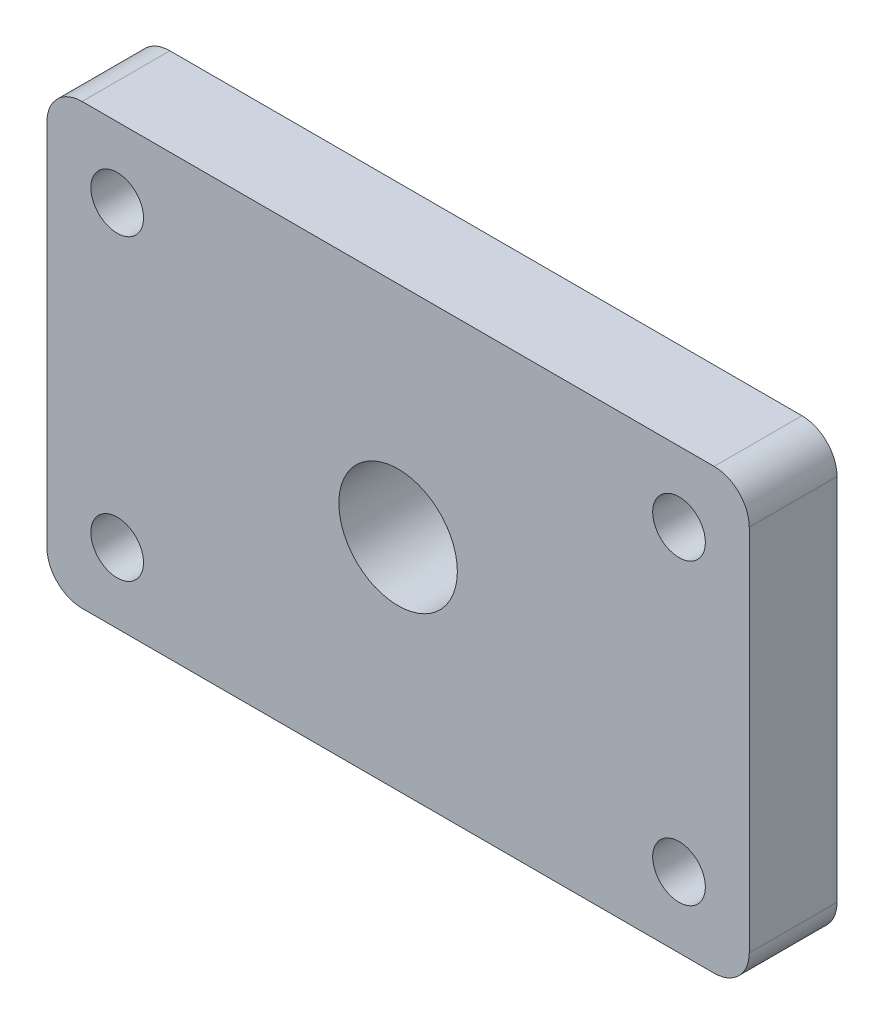
ISO-10303-21;
HEADER;
FILE_DESCRIPTION(('STEP AP214'),'2;1');
FILE_NAME('part.step','',(''),(''),'','','');
FILE_SCHEMA(('AUTOMOTIVE_DESIGN { 1 0 10303 214 1 1 1 1 }'));
ENDSEC;
DATA;
#1=APPLICATION_CONTEXT('core data for automotive mechanical design processes');
#2=APPLICATION_PROTOCOL_DEFINITION('international standard','automotive_design',2000,#1);
#3=PRODUCT_CONTEXT('',#1,'mechanical');
#4=PRODUCT('Part','Part','',(#3));
#5=PRODUCT_RELATED_PRODUCT_CATEGORY('part','',(#4));
#6=PRODUCT_DEFINITION_FORMATION('','',#4);
#7=PRODUCT_DEFINITION_CONTEXT('part definition',#1,'design');
#8=PRODUCT_DEFINITION('design','',#6,#7);
#9=PRODUCT_DEFINITION_SHAPE('','',#8);
#10=(LENGTH_UNIT() NAMED_UNIT(*) SI_UNIT(.MILLI.,.METRE.));
#11=(NAMED_UNIT(*) PLANE_ANGLE_UNIT() SI_UNIT($,.RADIAN.));
#12=(NAMED_UNIT(*) SI_UNIT($,.STERADIAN.) SOLID_ANGLE_UNIT());
#13=UNCERTAINTY_MEASURE_WITH_UNIT(LENGTH_MEASURE(1.E-05),#10,'distance_accuracy_value','');
#14=(GEOMETRIC_REPRESENTATION_CONTEXT(3) GLOBAL_UNCERTAINTY_ASSIGNED_CONTEXT((#13)) GLOBAL_UNIT_ASSIGNED_CONTEXT((#10,
#11,#12)) REPRESENTATION_CONTEXT('',''));
#15=CARTESIAN_POINT('',(0.,0.,0.));
#16=DIRECTION('',(0.,0.,1.));
#17=DIRECTION('',(1.,0.,0.));
#18=AXIS2_PLACEMENT_3D('',#15,#16,#17);
#19=CARTESIAN_POINT('',(-36.,-21.,10.));
#20=DIRECTION('',(0.,0.,1.));
#21=DIRECTION('',(1.,0.,0.));
#22=AXIS2_PLACEMENT_3D('',#19,#20,#21);
#23=PLANE('',#22);
#24=CARTESIAN_POINT('',(-32.,-17.,10.));
#25=DIRECTION('',(0.,0.,1.));
#26=DIRECTION('',(1.,0.,0.));
#27=AXIS2_PLACEMENT_3D('',#24,#25,#26);
#28=CIRCLE('',#27,3.);
#29=CARTESIAN_POINT('',(-29.,-17.,10.));
#30=VERTEX_POINT('',#29);
#31=EDGE_CURVE('E196',#30,#30,#28,.T.);
#32=ORIENTED_EDGE('',*,*,#31,.F.);
#33=EDGE_LOOP('',(#32));
#34=FACE_BOUND('',#33,.T.);
#35=CARTESIAN_POINT('',(32.,-17.,10.));
#36=DIRECTION('',(0.,0.,1.));
#37=DIRECTION('',(1.,0.,0.));
#38=AXIS2_PLACEMENT_3D('',#35,#36,#37);
#39=CIRCLE('',#38,3.00000000000001);
#40=CARTESIAN_POINT('',(35.,-17.,10.));
#41=VERTEX_POINT('',#40);
#42=EDGE_CURVE('E184',#41,#41,#39,.T.);
#43=ORIENTED_EDGE('',*,*,#42,.F.);
#44=EDGE_LOOP('',(#43));
#45=FACE_BOUND('',#44,.T.);
#46=CARTESIAN_POINT('',(-36.,-21.,10.));
#47=DIRECTION('',(0.,0.,1.));
#48=DIRECTION('',(1.,0.,0.));
#49=AXIS2_PLACEMENT_3D('',#46,#47,#48);
#50=CIRCLE('',#49,4.);
#51=CARTESIAN_POINT('',(-40.,-21.,10.));
#52=VERTEX_POINT('',#51);
#53=CARTESIAN_POINT('',(-36.,-25.,10.));
#54=VERTEX_POINT('',#53);
#55=EDGE_CURVE('E147',#52,#54,#50,.T.);
#56=ORIENTED_EDGE('',*,*,#55,.T.);
#57=DIRECTION('',(1.,0.,0.));
#58=VECTOR('',#57,1.);
#59=CARTESIAN_POINT('',(-36.,-25.,10.));
#60=LINE('',#59,#58);
#61=CARTESIAN_POINT('',(36.,-25.,10.));
#62=VERTEX_POINT('',#61);
#63=EDGE_CURVE('E95',#54,#62,#60,.T.);
#64=ORIENTED_EDGE('',*,*,#63,.T.);
#65=CARTESIAN_POINT('',(36.,-21.,10.));
#66=DIRECTION('',(0.,0.,1.));
#67=DIRECTION('',(1.,0.,0.));
#68=AXIS2_PLACEMENT_3D('',#65,#66,#67);
#69=CIRCLE('',#68,4.00000000000001);
#70=CARTESIAN_POINT('',(40.,-21.,10.));
#71=VERTEX_POINT('',#70);
#72=EDGE_CURVE('E162',#62,#71,#69,.T.);
#73=ORIENTED_EDGE('',*,*,#72,.T.);
#74=DIRECTION('',(0.,1.,0.));
#75=VECTOR('',#74,1.);
#76=CARTESIAN_POINT('',(40.,-21.,10.));
#77=LINE('',#76,#75);
#78=CARTESIAN_POINT('',(40.,21.,10.));
#79=VERTEX_POINT('',#78);
#80=EDGE_CURVE('E175',#71,#79,#77,.T.);
#81=ORIENTED_EDGE('',*,*,#80,.T.);
#82=CARTESIAN_POINT('',(36.,21.,10.));
#83=DIRECTION('',(0.,0.,1.));
#84=DIRECTION('',(1.,0.,0.));
#85=AXIS2_PLACEMENT_3D('',#82,#83,#84);
#86=CIRCLE('',#85,4.);
#87=CARTESIAN_POINT('',(36.,25.,10.));
#88=VERTEX_POINT('',#87);
#89=EDGE_CURVE('E114',#79,#88,#86,.T.);
#90=ORIENTED_EDGE('',*,*,#89,.T.);
#91=DIRECTION('',(-1.,0.,0.));
#92=VECTOR('',#91,1.);
#93=CARTESIAN_POINT('',(36.,25.,10.));
#94=LINE('',#93,#92);
#95=CARTESIAN_POINT('',(-36.,25.,10.));
#96=VERTEX_POINT('',#95);
#97=EDGE_CURVE('E108',#88,#96,#94,.T.);
#98=ORIENTED_EDGE('',*,*,#97,.T.);
#99=CARTESIAN_POINT('',(-36.,21.,10.));
#100=DIRECTION('',(0.,0.,1.));
#101=DIRECTION('',(1.,0.,0.));
#102=AXIS2_PLACEMENT_3D('',#99,#100,#101);
#103=CIRCLE('',#102,4.00000000000001);
#104=CARTESIAN_POINT('',(-40.,21.,10.));
#105=VERTEX_POINT('',#104);
#106=EDGE_CURVE('E112',#96,#105,#103,.T.);
#107=ORIENTED_EDGE('',*,*,#106,.T.);
#108=DIRECTION('',(0.,-1.,0.));
#109=VECTOR('',#108,1.);
#110=CARTESIAN_POINT('',(-40.,21.,10.));
#111=LINE('',#110,#109);
#112=EDGE_CURVE('E52',#105,#52,#111,.T.);
#113=ORIENTED_EDGE('',*,*,#112,.T.);
#114=EDGE_LOOP('',(#56,#64,#73,#81,#90,#98,#107,#113));
#115=FACE_BOUND('',#114,.T.);
#116=CARTESIAN_POINT('',(-32.,17.,10.));
#117=DIRECTION('',(0.,0.,1.));
#118=DIRECTION('',(1.,0.,0.));
#119=AXIS2_PLACEMENT_3D('',#116,#117,#118);
#120=CIRCLE('',#119,2.99999999999999);
#121=CARTESIAN_POINT('',(-29.,17.,10.));
#122=VERTEX_POINT('',#121);
#123=EDGE_CURVE('E136',#122,#122,#120,.T.);
#124=ORIENTED_EDGE('',*,*,#123,.F.);
#125=EDGE_LOOP('',(#124));
#126=FACE_BOUND('',#125,.T.);
#127=CARTESIAN_POINT('',(32.,17.,10.));
#128=DIRECTION('',(0.,0.,1.));
#129=DIRECTION('',(1.,0.,0.));
#130=AXIS2_PLACEMENT_3D('',#127,#128,#129);
#131=CIRCLE('',#130,3.00000000000001);
#132=CARTESIAN_POINT('',(35.,17.,10.));
#133=VERTEX_POINT('',#132);
#134=EDGE_CURVE('E190',#133,#133,#131,.T.);
#135=ORIENTED_EDGE('',*,*,#134,.F.);
#136=EDGE_LOOP('',(#135));
#137=FACE_BOUND('',#136,.T.);
#138=CARTESIAN_POINT('',(0.,0.,10.));
#139=DIRECTION('',(0.,0.,1.));
#140=DIRECTION('',(1.,0.,0.));
#141=AXIS2_PLACEMENT_3D('',#138,#139,#140);
#142=CIRCLE('',#141,6.74999999999999);
#143=CARTESIAN_POINT('',(6.74999999999999,0.,10.));
#144=VERTEX_POINT('',#143);
#145=EDGE_CURVE('E202',#144,#144,#142,.T.);
#146=ORIENTED_EDGE('',*,*,#145,.F.);
#147=EDGE_LOOP('',(#146));
#148=FACE_BOUND('',#147,.T.);
#149=ADVANCED_FACE('F35',(#34,#45,#115,#126,#137,#148),#23,.T.);
#150=CARTESIAN_POINT('',(-36.,-21.,0.));
#151=DIRECTION('',(0.,0.,1.));
#152=DIRECTION('',(1.,0.,0.));
#153=AXIS2_PLACEMENT_3D('',#150,#151,#152);
#154=PLANE('',#153);
#155=CARTESIAN_POINT('',(-36.,-21.,0.));
#156=DIRECTION('',(0.,0.,1.));
#157=DIRECTION('',(1.,0.,0.));
#158=AXIS2_PLACEMENT_3D('',#155,#156,#157);
#159=CIRCLE('',#158,4.);
#160=CARTESIAN_POINT('',(-40.,-21.,0.));
#161=VERTEX_POINT('',#160);
#162=CARTESIAN_POINT('',(-36.,-25.,0.));
#163=VERTEX_POINT('',#162);
#164=EDGE_CURVE('E132',#161,#163,#159,.T.);
#165=ORIENTED_EDGE('',*,*,#164,.F.);
#166=DIRECTION('',(0.,-1.,0.));
#167=VECTOR('',#166,1.);
#168=CARTESIAN_POINT('',(-40.,21.,0.));
#169=LINE('',#168,#167);
#170=CARTESIAN_POINT('',(-40.,21.,0.));
#171=VERTEX_POINT('',#170);
#172=EDGE_CURVE('E87',#171,#161,#169,.T.);
#173=ORIENTED_EDGE('',*,*,#172,.F.);
#174=CARTESIAN_POINT('',(-36.,21.,0.));
#175=DIRECTION('',(0.,0.,1.));
#176=DIRECTION('',(1.,0.,0.));
#177=AXIS2_PLACEMENT_3D('',#174,#175,#176);
#178=CIRCLE('',#177,4.00000000000001);
#179=CARTESIAN_POINT('',(-36.,25.,0.));
#180=VERTEX_POINT('',#179);
#181=EDGE_CURVE('E81',#180,#171,#178,.T.);
#182=ORIENTED_EDGE('',*,*,#181,.F.);
#183=DIRECTION('',(-1.,0.,0.));
#184=VECTOR('',#183,1.);
#185=CARTESIAN_POINT('',(36.,25.,0.));
#186=LINE('',#185,#184);
#187=CARTESIAN_POINT('',(36.,25.,0.));
#188=VERTEX_POINT('',#187);
#189=EDGE_CURVE('E122',#188,#180,#186,.T.);
#190=ORIENTED_EDGE('',*,*,#189,.F.);
#191=CARTESIAN_POINT('',(36.,21.,0.));
#192=DIRECTION('',(0.,0.,1.));
#193=DIRECTION('',(1.,0.,0.));
#194=AXIS2_PLACEMENT_3D('',#191,#192,#193);
#195=CIRCLE('',#194,4.);
#196=CARTESIAN_POINT('',(40.,21.,0.));
#197=VERTEX_POINT('',#196);
#198=EDGE_CURVE('E142',#197,#188,#195,.T.);
#199=ORIENTED_EDGE('',*,*,#198,.F.);
#200=DIRECTION('',(0.,1.,0.));
#201=VECTOR('',#200,1.);
#202=CARTESIAN_POINT('',(40.,-21.,0.));
#203=LINE('',#202,#201);
#204=CARTESIAN_POINT('',(40.,-21.,0.));
#205=VERTEX_POINT('',#204);
#206=EDGE_CURVE('E140',#205,#197,#203,.T.);
#207=ORIENTED_EDGE('',*,*,#206,.F.);
#208=CARTESIAN_POINT('',(36.,-21.,0.));
#209=DIRECTION('',(0.,0.,1.));
#210=DIRECTION('',(1.,0.,0.));
#211=AXIS2_PLACEMENT_3D('',#208,#209,#210);
#212=CIRCLE('',#211,4.00000000000001);
#213=CARTESIAN_POINT('',(36.,-25.,0.));
#214=VERTEX_POINT('',#213);
#215=EDGE_CURVE('E138',#214,#205,#212,.T.);
#216=ORIENTED_EDGE('',*,*,#215,.F.);
#217=DIRECTION('',(1.,0.,0.));
#218=VECTOR('',#217,1.);
#219=CARTESIAN_POINT('',(-36.,-25.,0.));
#220=LINE('',#219,#218);
#221=EDGE_CURVE('E135',#163,#214,#220,.T.);
#222=ORIENTED_EDGE('',*,*,#221,.F.);
#223=EDGE_LOOP('',(#165,#173,#182,#190,#199,#207,#216,#222));
#224=FACE_BOUND('',#223,.T.);
#225=CARTESIAN_POINT('',(-32.,17.,0.));
#226=DIRECTION('',(0.,0.,1.));
#227=DIRECTION('',(1.,0.,0.));
#228=AXIS2_PLACEMENT_3D('',#225,#226,#227);
#229=CIRCLE('',#228,2.99999999999999);
#230=CARTESIAN_POINT('',(-29.,17.,0.));
#231=VERTEX_POINT('',#230);
#232=EDGE_CURVE('E181',#231,#231,#229,.T.);
#233=ORIENTED_EDGE('',*,*,#232,.T.);
#234=EDGE_LOOP('',(#233));
#235=FACE_BOUND('',#234,.T.);
#236=CARTESIAN_POINT('',(32.,-17.,0.));
#237=DIRECTION('',(0.,0.,1.));
#238=DIRECTION('',(1.,0.,0.));
#239=AXIS2_PLACEMENT_3D('',#236,#237,#238);
#240=CIRCLE('',#239,3.00000000000001);
#241=CARTESIAN_POINT('',(35.,-17.,0.));
#242=VERTEX_POINT('',#241);
#243=EDGE_CURVE('E187',#242,#242,#240,.T.);
#244=ORIENTED_EDGE('',*,*,#243,.T.);
#245=EDGE_LOOP('',(#244));
#246=FACE_BOUND('',#245,.T.);
#247=CARTESIAN_POINT('',(32.,17.,0.));
#248=DIRECTION('',(0.,0.,1.));
#249=DIRECTION('',(1.,0.,0.));
#250=AXIS2_PLACEMENT_3D('',#247,#248,#249);
#251=CIRCLE('',#250,3.00000000000001);
#252=CARTESIAN_POINT('',(35.,17.,0.));
#253=VERTEX_POINT('',#252);
#254=EDGE_CURVE('E193',#253,#253,#251,.T.);
#255=ORIENTED_EDGE('',*,*,#254,.T.);
#256=EDGE_LOOP('',(#255));
#257=FACE_BOUND('',#256,.T.);
#258=CARTESIAN_POINT('',(-32.,-17.,0.));
#259=DIRECTION('',(0.,0.,1.));
#260=DIRECTION('',(1.,0.,0.));
#261=AXIS2_PLACEMENT_3D('',#258,#259,#260);
#262=CIRCLE('',#261,3.);
#263=CARTESIAN_POINT('',(-29.,-17.,0.));
#264=VERTEX_POINT('',#263);
#265=EDGE_CURVE('E199',#264,#264,#262,.T.);
#266=ORIENTED_EDGE('',*,*,#265,.T.);
#267=EDGE_LOOP('',(#266));
#268=FACE_BOUND('',#267,.T.);
#269=CARTESIAN_POINT('',(0.,0.,0.));
#270=DIRECTION('',(0.,0.,1.));
#271=DIRECTION('',(1.,0.,0.));
#272=AXIS2_PLACEMENT_3D('',#269,#270,#271);
#273=CIRCLE('',#272,6.74999999999999);
#274=CARTESIAN_POINT('',(6.74999999999999,0.,0.));
#275=VERTEX_POINT('',#274);
#276=EDGE_CURVE('E205',#275,#275,#273,.T.);
#277=ORIENTED_EDGE('',*,*,#276,.T.);
#278=EDGE_LOOP('',(#277));
#279=FACE_BOUND('',#278,.T.);
#280=ADVANCED_FACE('F166',(#224,#235,#246,#257,#268,#279),#154,.F.);
#281=CARTESIAN_POINT('',(-36.,-21.,10.));
#282=DIRECTION('',(0.,0.,-1.));
#283=DIRECTION('',(-1.,0.,0.));
#284=AXIS2_PLACEMENT_3D('',#281,#282,#283);
#285=CYLINDRICAL_SURFACE('',#284,4.);
#286=ORIENTED_EDGE('',*,*,#164,.T.);
#287=DIRECTION('',(0.,0.,-1.));
#288=VECTOR('',#287,1.);
#289=CARTESIAN_POINT('',(-36.,-25.,10.));
#290=LINE('',#289,#288);
#291=EDGE_CURVE('E11',#54,#163,#290,.T.);
#292=ORIENTED_EDGE('',*,*,#291,.F.);
#293=ORIENTED_EDGE('',*,*,#55,.F.);
#294=DIRECTION('',(0.,0.,-1.));
#295=VECTOR('',#294,1.);
#296=CARTESIAN_POINT('',(-40.,-21.,10.));
#297=LINE('',#296,#295);
#298=EDGE_CURVE('E128',#52,#161,#297,.T.);
#299=ORIENTED_EDGE('',*,*,#298,.T.);
#300=EDGE_LOOP('',(#286,#292,#293,#299));
#301=FACE_BOUND('',#300,.T.);
#302=ADVANCED_FACE('F37',(#301),#285,.T.);
#303=CARTESIAN_POINT('',(-36.,-25.,10.));
#304=DIRECTION('',(0.,1.,0.));
#305=DIRECTION('',(0.,0.,1.));
#306=AXIS2_PLACEMENT_3D('',#303,#304,#305);
#307=PLANE('',#306);
#308=ORIENTED_EDGE('',*,*,#221,.T.);
#309=DIRECTION('',(0.,0.,-1.));
#310=VECTOR('',#309,1.);
#311=CARTESIAN_POINT('',(36.,-25.,10.));
#312=LINE('',#311,#310);
#313=EDGE_CURVE('E44',#62,#214,#312,.T.);
#314=ORIENTED_EDGE('',*,*,#313,.F.);
#315=ORIENTED_EDGE('',*,*,#63,.F.);
#316=ORIENTED_EDGE('',*,*,#291,.T.);
#317=EDGE_LOOP('',(#308,#314,#315,#316));
#318=FACE_BOUND('',#317,.T.);
#319=ADVANCED_FACE('F239',(#318),#307,.F.);
#320=CARTESIAN_POINT('',(36.,-21.,10.));
#321=DIRECTION('',(0.,0.,-1.));
#322=DIRECTION('',(-1.,0.,0.));
#323=AXIS2_PLACEMENT_3D('',#320,#321,#322);
#324=CYLINDRICAL_SURFACE('',#323,4.00000000000001);
#325=ORIENTED_EDGE('',*,*,#215,.T.);
#326=DIRECTION('',(0.,0.,-1.));
#327=VECTOR('',#326,1.);
#328=CARTESIAN_POINT('',(40.,-21.,10.));
#329=LINE('',#328,#327);
#330=EDGE_CURVE('E154',#71,#205,#329,.T.);
#331=ORIENTED_EDGE('',*,*,#330,.F.);
#332=ORIENTED_EDGE('',*,*,#72,.F.);
#333=ORIENTED_EDGE('',*,*,#313,.T.);
#334=EDGE_LOOP('',(#325,#331,#332,#333));
#335=FACE_BOUND('',#334,.T.);
#336=ADVANCED_FACE('F160',(#335),#324,.T.);
#337=CARTESIAN_POINT('',(40.,-21.,10.));
#338=DIRECTION('',(-1.,0.,0.));
#339=DIRECTION('',(0.,0.,1.));
#340=AXIS2_PLACEMENT_3D('',#337,#338,#339);
#341=PLANE('',#340);
#342=ORIENTED_EDGE('',*,*,#206,.T.);
#343=DIRECTION('',(0.,0.,-1.));
#344=VECTOR('',#343,1.);
#345=CARTESIAN_POINT('',(40.,21.,10.));
#346=LINE('',#345,#344);
#347=EDGE_CURVE('E151',#79,#197,#346,.T.);
#348=ORIENTED_EDGE('',*,*,#347,.F.);
#349=ORIENTED_EDGE('',*,*,#80,.F.);
#350=ORIENTED_EDGE('',*,*,#330,.T.);
#351=EDGE_LOOP('',(#342,#348,#349,#350));
#352=FACE_BOUND('',#351,.T.);
#353=ADVANCED_FACE('F171',(#352),#341,.F.);
#354=CARTESIAN_POINT('',(36.,21.,10.));
#355=DIRECTION('',(0.,0.,-1.));
#356=DIRECTION('',(-1.,0.,0.));
#357=AXIS2_PLACEMENT_3D('',#354,#355,#356);
#358=CYLINDRICAL_SURFACE('',#357,4.);
#359=ORIENTED_EDGE('',*,*,#198,.T.);
#360=DIRECTION('',(0.,0.,-1.));
#361=VECTOR('',#360,1.);
#362=CARTESIAN_POINT('',(36.,25.,10.));
#363=LINE('',#362,#361);
#364=EDGE_CURVE('E123',#88,#188,#363,.T.);
#365=ORIENTED_EDGE('',*,*,#364,.F.);
#366=ORIENTED_EDGE('',*,*,#89,.F.);
#367=ORIENTED_EDGE('',*,*,#347,.T.);
#368=EDGE_LOOP('',(#359,#365,#366,#367));
#369=FACE_BOUND('',#368,.T.);
#370=ADVANCED_FACE('F174',(#369),#358,.T.);
#371=CARTESIAN_POINT('',(36.,25.,10.));
#372=DIRECTION('',(0.,-1.,0.));
#373=DIRECTION('',(0.,0.,-1.));
#374=AXIS2_PLACEMENT_3D('',#371,#372,#373);
#375=PLANE('',#374);
#376=ORIENTED_EDGE('',*,*,#189,.T.);
#377=DIRECTION('',(0.,0.,-1.));
#378=VECTOR('',#377,1.);
#379=CARTESIAN_POINT('',(-36.,25.,10.));
#380=LINE('',#379,#378);
#381=EDGE_CURVE('E119',#96,#180,#380,.T.);
#382=ORIENTED_EDGE('',*,*,#381,.F.);
#383=ORIENTED_EDGE('',*,*,#97,.F.);
#384=ORIENTED_EDGE('',*,*,#364,.T.);
#385=EDGE_LOOP('',(#376,#382,#383,#384));
#386=FACE_BOUND('',#385,.T.);
#387=ADVANCED_FACE('F120',(#386),#375,.F.);
#388=CARTESIAN_POINT('',(-36.,21.,10.));
#389=DIRECTION('',(0.,0.,-1.));
#390=DIRECTION('',(-1.,0.,0.));
#391=AXIS2_PLACEMENT_3D('',#388,#389,#390);
#392=CYLINDRICAL_SURFACE('',#391,4.00000000000001);
#393=ORIENTED_EDGE('',*,*,#181,.T.);
#394=DIRECTION('',(0.,0.,-1.));
#395=VECTOR('',#394,1.);
#396=CARTESIAN_POINT('',(-40.,21.,10.));
#397=LINE('',#396,#395);
#398=EDGE_CURVE('E124',#105,#171,#397,.T.);
#399=ORIENTED_EDGE('',*,*,#398,.F.);
#400=ORIENTED_EDGE('',*,*,#106,.F.);
#401=ORIENTED_EDGE('',*,*,#381,.T.);
#402=EDGE_LOOP('',(#393,#399,#400,#401));
#403=FACE_BOUND('',#402,.T.);
#404=ADVANCED_FACE('F126',(#403),#392,.T.);
#405=CARTESIAN_POINT('',(-40.,21.,10.));
#406=DIRECTION('',(1.,0.,0.));
#407=DIRECTION('',(0.,0.,-1.));
#408=AXIS2_PLACEMENT_3D('',#405,#406,#407);
#409=PLANE('',#408);
#410=ORIENTED_EDGE('',*,*,#172,.T.);
#411=ORIENTED_EDGE('',*,*,#298,.F.);
#412=ORIENTED_EDGE('',*,*,#112,.F.);
#413=ORIENTED_EDGE('',*,*,#398,.T.);
#414=EDGE_LOOP('',(#410,#411,#412,#413));
#415=FACE_BOUND('',#414,.T.);
#416=ADVANCED_FACE('F227',(#415),#409,.F.);
#417=CARTESIAN_POINT('',(-32.,17.,10.));
#418=DIRECTION('',(0.,0.,-1.));
#419=DIRECTION('',(-1.,0.,0.));
#420=AXIS2_PLACEMENT_3D('',#417,#418,#419);
#421=CYLINDRICAL_SURFACE('',#420,2.99999999999999);
#422=ORIENTED_EDGE('',*,*,#123,.T.);
#423=EDGE_LOOP('',(#422));
#424=FACE_BOUND('',#423,.T.);
#425=ORIENTED_EDGE('',*,*,#232,.F.);
#426=EDGE_LOOP('',(#425));
#427=FACE_BOUND('',#426,.T.);
#428=ADVANCED_FACE('F224',(#424,#427),#421,.F.);
#429=CARTESIAN_POINT('',(32.,-17.,10.));
#430=DIRECTION('',(0.,0.,-1.));
#431=DIRECTION('',(-1.,0.,0.));
#432=AXIS2_PLACEMENT_3D('',#429,#430,#431);
#433=CYLINDRICAL_SURFACE('',#432,3.00000000000001);
#434=ORIENTED_EDGE('',*,*,#42,.T.);
#435=EDGE_LOOP('',(#434));
#436=FACE_BOUND('',#435,.T.);
#437=ORIENTED_EDGE('',*,*,#243,.F.);
#438=EDGE_LOOP('',(#437));
#439=FACE_BOUND('',#438,.T.);
#440=ADVANCED_FACE('F303',(#436,#439),#433,.F.);
#441=CARTESIAN_POINT('',(32.,17.,10.));
#442=DIRECTION('',(0.,0.,-1.));
#443=DIRECTION('',(-1.,0.,0.));
#444=AXIS2_PLACEMENT_3D('',#441,#442,#443);
#445=CYLINDRICAL_SURFACE('',#444,3.00000000000001);
#446=ORIENTED_EDGE('',*,*,#134,.T.);
#447=EDGE_LOOP('',(#446));
#448=FACE_BOUND('',#447,.T.);
#449=ORIENTED_EDGE('',*,*,#254,.F.);
#450=EDGE_LOOP('',(#449));
#451=FACE_BOUND('',#450,.T.);
#452=ADVANCED_FACE('F311',(#448,#451),#445,.F.);
#453=CARTESIAN_POINT('',(-32.,-17.,10.));
#454=DIRECTION('',(0.,0.,-1.));
#455=DIRECTION('',(-1.,0.,0.));
#456=AXIS2_PLACEMENT_3D('',#453,#454,#455);
#457=CYLINDRICAL_SURFACE('',#456,3.);
#458=ORIENTED_EDGE('',*,*,#31,.T.);
#459=EDGE_LOOP('',(#458));
#460=FACE_BOUND('',#459,.T.);
#461=ORIENTED_EDGE('',*,*,#265,.F.);
#462=EDGE_LOOP('',(#461));
#463=FACE_BOUND('',#462,.T.);
#464=ADVANCED_FACE('F319',(#460,#463),#457,.F.);
#465=CARTESIAN_POINT('',(0.,0.,10.));
#466=DIRECTION('',(0.,0.,-1.));
#467=DIRECTION('',(-1.,0.,0.));
#468=AXIS2_PLACEMENT_3D('',#465,#466,#467);
#469=CYLINDRICAL_SURFACE('',#468,6.74999999999999);
#470=ORIENTED_EDGE('',*,*,#145,.T.);
#471=EDGE_LOOP('',(#470));
#472=FACE_BOUND('',#471,.T.);
#473=ORIENTED_EDGE('',*,*,#276,.F.);
#474=EDGE_LOOP('',(#473));
#475=FACE_BOUND('',#474,.T.);
#476=ADVANCED_FACE('F211',(#472,#475),#469,.F.);
#477=CLOSED_SHELL('',(#149,#280,#302,#319,#336,#353,#370,#387,#404,#416,#428,#440,#452,#464,#476));
#478=MANIFOLD_SOLID_BREP('B2',#477);
#479=ADVANCED_BREP_SHAPE_REPRESENTATION('',(#18,#478),#14);
#480=SHAPE_DEFINITION_REPRESENTATION(#9,#479);
ENDSEC;
END-ISO-10303-21;
